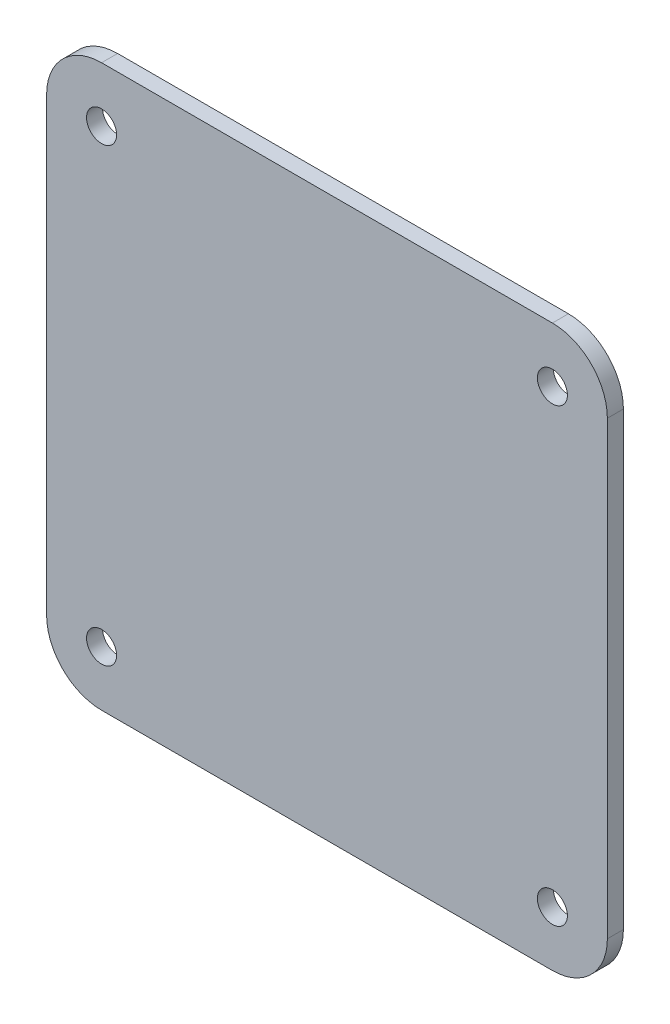
ISO-10303-21;
HEADER;
FILE_DESCRIPTION(('STEP AP214'),'2;1');
FILE_NAME('part.step','',(''),(''),'','','');
FILE_SCHEMA(('AUTOMOTIVE_DESIGN { 1 0 10303 214 1 1 1 1 }'));
ENDSEC;
DATA;
#1=APPLICATION_CONTEXT('core data for automotive mechanical design processes');
#2=APPLICATION_PROTOCOL_DEFINITION('international standard','automotive_design',2000,#1);
#3=PRODUCT_CONTEXT('',#1,'mechanical');
#4=PRODUCT('Part','Part','',(#3));
#5=PRODUCT_RELATED_PRODUCT_CATEGORY('part','',(#4));
#6=PRODUCT_DEFINITION_FORMATION('','',#4);
#7=PRODUCT_DEFINITION_CONTEXT('part definition',#1,'design');
#8=PRODUCT_DEFINITION('design','',#6,#7);
#9=PRODUCT_DEFINITION_SHAPE('','',#8);
#10=(LENGTH_UNIT() NAMED_UNIT(*) SI_UNIT(.MILLI.,.METRE.));
#11=(NAMED_UNIT(*) PLANE_ANGLE_UNIT() SI_UNIT($,.RADIAN.));
#12=(NAMED_UNIT(*) SI_UNIT($,.STERADIAN.) SOLID_ANGLE_UNIT());
#13=UNCERTAINTY_MEASURE_WITH_UNIT(LENGTH_MEASURE(1.E-05),#10,'distance_accuracy_value','');
#14=(GEOMETRIC_REPRESENTATION_CONTEXT(3) GLOBAL_UNCERTAINTY_ASSIGNED_CONTEXT((#13)) GLOBAL_UNIT_ASSIGNED_CONTEXT((#10,
#11,#12)) REPRESENTATION_CONTEXT('',''));
#15=CARTESIAN_POINT('',(0.,0.,0.));
#16=DIRECTION('',(0.,0.,1.));
#17=DIRECTION('',(1.,0.,0.));
#18=AXIS2_PLACEMENT_3D('',#15,#16,#17);
#19=CARTESIAN_POINT('',(-50.5,-5.5,0.));
#20=DIRECTION('',(0.,0.,1.));
#21=DIRECTION('',(1.,0.,0.));
#22=AXIS2_PLACEMENT_3D('',#19,#20,#21);
#23=CYLINDRICAL_SURFACE('',#22,1.5);
#24=DIRECTION('',(0.,0.,1.));
#25=VECTOR('',#24,1.);
#26=CARTESIAN_POINT('',(-49.,-5.5,0.));
#27=LINE('',#26,#25);
#28=CARTESIAN_POINT('',(-49.,-5.5,0.));
#29=VERTEX_POINT('',#28);
#30=CARTESIAN_POINT('',(-49.,-5.5,1.600050800102));
#31=VERTEX_POINT('',#30);
#32=EDGE_CURVE('E11',#29,#31,#27,.T.);
#33=ORIENTED_EDGE('',*,*,#32,.F.);
#34=CARTESIAN_POINT('',(-50.5,-5.5,0.));
#35=DIRECTION('',(0.,0.,1.));
#36=DIRECTION('',(1.,0.,0.));
#37=AXIS2_PLACEMENT_3D('',#34,#35,#36);
#38=CIRCLE('',#37,1.5);
#39=EDGE_CURVE('E142',#29,#29,#38,.T.);
#40=ORIENTED_EDGE('',*,*,#39,.F.);
#41=ORIENTED_EDGE('',*,*,#32,.T.);
#42=CARTESIAN_POINT('',(-50.5,-5.5,1.600050800102));
#43=DIRECTION('',(0.,0.,1.));
#44=DIRECTION('',(1.,0.,0.));
#45=AXIS2_PLACEMENT_3D('',#42,#43,#44);
#46=CIRCLE('',#45,1.5);
#47=EDGE_CURVE('E217',#31,#31,#46,.T.);
#48=ORIENTED_EDGE('',*,*,#47,.T.);
#49=EDGE_LOOP('',(#33,#40,#41,#48));
#50=FACE_BOUND('',#49,.T.);
#51=ADVANCED_FACE('F16',(#50),#23,.F.);
#52=CARTESIAN_POINT('',(-5.5,-5.5,0.));
#53=DIRECTION('',(0.,0.,1.));
#54=DIRECTION('',(1.,0.,0.));
#55=AXIS2_PLACEMENT_3D('',#52,#53,#54);
#56=CYLINDRICAL_SURFACE('',#55,1.5);
#57=DIRECTION('',(0.,0.,1.));
#58=VECTOR('',#57,1.);
#59=CARTESIAN_POINT('',(-4.,-5.5,0.));
#60=LINE('',#59,#58);
#61=CARTESIAN_POINT('',(-4.,-5.5,0.));
#62=VERTEX_POINT('',#61);
#63=CARTESIAN_POINT('',(-4.,-5.5,1.600050800102));
#64=VERTEX_POINT('',#63);
#65=EDGE_CURVE('E27',#62,#64,#60,.T.);
#66=ORIENTED_EDGE('',*,*,#65,.F.);
#67=CARTESIAN_POINT('',(-5.5,-5.5,0.));
#68=DIRECTION('',(0.,0.,1.));
#69=DIRECTION('',(1.,0.,0.));
#70=AXIS2_PLACEMENT_3D('',#67,#68,#69);
#71=CIRCLE('',#70,1.5);
#72=EDGE_CURVE('E169',#62,#62,#71,.T.);
#73=ORIENTED_EDGE('',*,*,#72,.F.);
#74=ORIENTED_EDGE('',*,*,#65,.T.);
#75=CARTESIAN_POINT('',(-5.5,-5.5,1.600050800102));
#76=DIRECTION('',(0.,0.,1.));
#77=DIRECTION('',(1.,0.,0.));
#78=AXIS2_PLACEMENT_3D('',#75,#76,#77);
#79=CIRCLE('',#78,1.5);
#80=EDGE_CURVE('E221',#64,#64,#79,.T.);
#81=ORIENTED_EDGE('',*,*,#80,.T.);
#82=EDGE_LOOP('',(#66,#73,#74,#81));
#83=FACE_BOUND('',#82,.T.);
#84=ADVANCED_FACE('F318',(#83),#56,.F.);
#85=CARTESIAN_POINT('',(-50.5,-50.5,0.));
#86=DIRECTION('',(0.,0.,1.));
#87=DIRECTION('',(1.,0.,0.));
#88=AXIS2_PLACEMENT_3D('',#85,#86,#87);
#89=CYLINDRICAL_SURFACE('',#88,1.5);
#90=DIRECTION('',(0.,0.,1.));
#91=VECTOR('',#90,1.);
#92=CARTESIAN_POINT('',(-49.,-50.5,0.));
#93=LINE('',#92,#91);
#94=CARTESIAN_POINT('',(-49.,-50.5,0.));
#95=VERTEX_POINT('',#94);
#96=CARTESIAN_POINT('',(-49.,-50.5,1.600050800102));
#97=VERTEX_POINT('',#96);
#98=EDGE_CURVE('E174',#95,#97,#93,.T.);
#99=ORIENTED_EDGE('',*,*,#98,.F.);
#100=CARTESIAN_POINT('',(-50.5,-50.5,0.));
#101=DIRECTION('',(0.,0.,1.));
#102=DIRECTION('',(1.,0.,0.));
#103=AXIS2_PLACEMENT_3D('',#100,#101,#102);
#104=CIRCLE('',#103,1.5);
#105=EDGE_CURVE('E173',#95,#95,#104,.T.);
#106=ORIENTED_EDGE('',*,*,#105,.F.);
#107=ORIENTED_EDGE('',*,*,#98,.T.);
#108=CARTESIAN_POINT('',(-50.5,-50.5,1.600050800102));
#109=DIRECTION('',(0.,0.,1.));
#110=DIRECTION('',(1.,0.,0.));
#111=AXIS2_PLACEMENT_3D('',#108,#109,#110);
#112=CIRCLE('',#111,1.5);
#113=EDGE_CURVE('E164',#97,#97,#112,.T.);
#114=ORIENTED_EDGE('',*,*,#113,.T.);
#115=EDGE_LOOP('',(#99,#106,#107,#114));
#116=FACE_BOUND('',#115,.T.);
#117=ADVANCED_FACE('F18',(#116),#89,.F.);
#118=CARTESIAN_POINT('',(-5.5,-50.5,0.));
#119=DIRECTION('',(0.,0.,1.));
#120=DIRECTION('',(1.,0.,0.));
#121=AXIS2_PLACEMENT_3D('',#118,#119,#120);
#122=CYLINDRICAL_SURFACE('',#121,1.5);
#123=DIRECTION('',(0.,0.,1.));
#124=VECTOR('',#123,1.);
#125=CARTESIAN_POINT('',(-4.,-50.5,0.));
#126=LINE('',#125,#124);
#127=CARTESIAN_POINT('',(-4.,-50.5,0.));
#128=VERTEX_POINT('',#127);
#129=CARTESIAN_POINT('',(-4.,-50.5,1.600050800102));
#130=VERTEX_POINT('',#129);
#131=EDGE_CURVE('E177',#128,#130,#126,.T.);
#132=ORIENTED_EDGE('',*,*,#131,.F.);
#133=CARTESIAN_POINT('',(-5.5,-50.5,0.));
#134=DIRECTION('',(0.,0.,1.));
#135=DIRECTION('',(1.,0.,0.));
#136=AXIS2_PLACEMENT_3D('',#133,#134,#135);
#137=CIRCLE('',#136,1.5);
#138=EDGE_CURVE('E199',#128,#128,#137,.T.);
#139=ORIENTED_EDGE('',*,*,#138,.F.);
#140=ORIENTED_EDGE('',*,*,#131,.T.);
#141=CARTESIAN_POINT('',(-5.5,-50.5,1.600050800102));
#142=DIRECTION('',(0.,0.,1.));
#143=DIRECTION('',(1.,0.,0.));
#144=AXIS2_PLACEMENT_3D('',#141,#142,#143);
#145=CIRCLE('',#144,1.5);
#146=EDGE_CURVE('E160',#130,#130,#145,.T.);
#147=ORIENTED_EDGE('',*,*,#146,.T.);
#148=EDGE_LOOP('',(#132,#139,#140,#147));
#149=FACE_BOUND('',#148,.T.);
#150=ADVANCED_FACE('F328',(#149),#122,.F.);
#151=CARTESIAN_POINT('',(-5.5,-5.5,0.));
#152=DIRECTION('',(0.,0.,-1.));
#153=DIRECTION('',(0.,1.,0.));
#154=AXIS2_PLACEMENT_3D('',#151,#152,#153);
#155=CYLINDRICAL_SURFACE('',#154,5.4872999746);
#156=DIRECTION('',(0.,0.,1.));
#157=VECTOR('',#156,1.);
#158=CARTESIAN_POINT('',(-5.5,-0.01270002540005,0.));
#159=LINE('',#158,#157);
#160=CARTESIAN_POINT('',(-5.5,-0.01270002540005,0.));
#161=VERTEX_POINT('',#160);
#162=CARTESIAN_POINT('',(-5.5,-0.01270002540005,1.600050800102));
#163=VERTEX_POINT('',#162);
#164=EDGE_CURVE('E67',#161,#163,#159,.T.);
#165=ORIENTED_EDGE('',*,*,#164,.T.);
#166=CARTESIAN_POINT('',(-5.5,-5.5,1.600050800102));
#167=DIRECTION('',(0.,0.,-1.));
#168=DIRECTION('',(0.,1.,0.));
#169=AXIS2_PLACEMENT_3D('',#166,#167,#168);
#170=CIRCLE('',#169,5.4872999746);
#171=CARTESIAN_POINT('',(-0.01270002540005,-5.5,1.600050800102));
#172=VERTEX_POINT('',#171);
#173=EDGE_CURVE('E126',#163,#172,#170,.T.);
#174=ORIENTED_EDGE('',*,*,#173,.T.);
#175=DIRECTION('',(0.,0.,1.));
#176=VECTOR('',#175,1.);
#177=CARTESIAN_POINT('',(-0.01270002540005,-5.5,0.));
#178=LINE('',#177,#176);
#179=CARTESIAN_POINT('',(-0.01270002540005,-5.5,0.));
#180=VERTEX_POINT('',#179);
#181=EDGE_CURVE('E53',#180,#172,#178,.T.);
#182=ORIENTED_EDGE('',*,*,#181,.F.);
#183=CARTESIAN_POINT('',(-5.5,-5.5,0.));
#184=DIRECTION('',(0.,0.,-1.));
#185=DIRECTION('',(0.,1.,0.));
#186=AXIS2_PLACEMENT_3D('',#183,#184,#185);
#187=CIRCLE('',#186,5.4872999746);
#188=EDGE_CURVE('E20',#161,#180,#187,.T.);
#189=ORIENTED_EDGE('',*,*,#188,.F.);
#190=EDGE_LOOP('',(#165,#174,#182,#189));
#191=FACE_BOUND('',#190,.T.);
#192=ADVANCED_FACE('F127',(#191),#155,.T.);
#193=CARTESIAN_POINT('',(-50.5,-0.01270002540005,0.));
#194=DIRECTION('',(0.,1.,0.));
#195=DIRECTION('',(1.,0.,0.));
#196=AXIS2_PLACEMENT_3D('',#193,#194,#195);
#197=PLANE('',#196);
#198=DIRECTION('',(0.,0.,1.));
#199=VECTOR('',#198,1.);
#200=CARTESIAN_POINT('',(-50.5,-0.01270002540005,0.));
#201=LINE('',#200,#199);
#202=CARTESIAN_POINT('',(-50.5,-0.01270002540005,0.));
#203=VERTEX_POINT('',#202);
#204=CARTESIAN_POINT('',(-50.5,-0.01270002540005,1.600050800102));
#205=VERTEX_POINT('',#204);
#206=EDGE_CURVE('E79',#203,#205,#201,.T.);
#207=ORIENTED_EDGE('',*,*,#206,.T.);
#208=DIRECTION('',(1.,0.,0.));
#209=VECTOR('',#208,1.);
#210=CARTESIAN_POINT('',(-50.5,-0.01270002540005,1.600050800102));
#211=LINE('',#210,#209);
#212=EDGE_CURVE('E131',#205,#163,#211,.T.);
#213=ORIENTED_EDGE('',*,*,#212,.T.);
#214=ORIENTED_EDGE('',*,*,#164,.F.);
#215=DIRECTION('',(1.,0.,0.));
#216=VECTOR('',#215,1.);
#217=CARTESIAN_POINT('',(-50.5,-0.01270002540005,0.));
#218=LINE('',#217,#216);
#219=EDGE_CURVE('E224',#203,#161,#218,.T.);
#220=ORIENTED_EDGE('',*,*,#219,.F.);
#221=EDGE_LOOP('',(#207,#213,#214,#220));
#222=FACE_BOUND('',#221,.T.);
#223=ADVANCED_FACE('F315',(#222),#197,.T.);
#224=CARTESIAN_POINT('',(-0.01270002540005,-5.5,0.));
#225=DIRECTION('',(1.,0.,0.));
#226=DIRECTION('',(0.,-1.,0.));
#227=AXIS2_PLACEMENT_3D('',#224,#225,#226);
#228=PLANE('',#227);
#229=ORIENTED_EDGE('',*,*,#181,.T.);
#230=DIRECTION('',(0.,-1.,0.));
#231=VECTOR('',#230,1.);
#232=CARTESIAN_POINT('',(-0.01270002540005,-5.5,1.600050800102));
#233=LINE('',#232,#231);
#234=CARTESIAN_POINT('',(-0.01270002540005,-50.5,1.600050800102));
#235=VERTEX_POINT('',#234);
#236=EDGE_CURVE('E118',#172,#235,#233,.T.);
#237=ORIENTED_EDGE('',*,*,#236,.T.);
#238=DIRECTION('',(0.,0.,1.));
#239=VECTOR('',#238,1.);
#240=CARTESIAN_POINT('',(-0.01270002540005,-50.5,0.));
#241=LINE('',#240,#239);
#242=CARTESIAN_POINT('',(-0.01270002540005,-50.5,0.));
#243=VERTEX_POINT('',#242);
#244=EDGE_CURVE('E168',#243,#235,#241,.T.);
#245=ORIENTED_EDGE('',*,*,#244,.F.);
#246=DIRECTION('',(0.,-1.,0.));
#247=VECTOR('',#246,1.);
#248=CARTESIAN_POINT('',(-0.01270002540005,-5.5,0.));
#249=LINE('',#248,#247);
#250=EDGE_CURVE('E121',#180,#243,#249,.T.);
#251=ORIENTED_EDGE('',*,*,#250,.F.);
#252=EDGE_LOOP('',(#229,#237,#245,#251));
#253=FACE_BOUND('',#252,.T.);
#254=ADVANCED_FACE('F116',(#253),#228,.T.);
#255=CARTESIAN_POINT('',(-50.5,-5.5,0.));
#256=DIRECTION('',(0.,0.,-1.));
#257=DIRECTION('',(-1.,0.,0.));
#258=AXIS2_PLACEMENT_3D('',#255,#256,#257);
#259=CYLINDRICAL_SURFACE('',#258,5.4872999746);
#260=DIRECTION('',(0.,0.,1.));
#261=VECTOR('',#260,1.);
#262=CARTESIAN_POINT('',(-55.9872999746,-5.5,0.));
#263=LINE('',#262,#261);
#264=CARTESIAN_POINT('',(-55.9872999746,-5.5,0.));
#265=VERTEX_POINT('',#264);
#266=CARTESIAN_POINT('',(-55.9872999746,-5.5,1.600050800102));
#267=VERTEX_POINT('',#266);
#268=EDGE_CURVE('E159',#265,#267,#263,.T.);
#269=ORIENTED_EDGE('',*,*,#268,.T.);
#270=CARTESIAN_POINT('',(-50.5,-5.5,1.600050800102));
#271=DIRECTION('',(0.,0.,-1.));
#272=DIRECTION('',(-1.,0.,0.));
#273=AXIS2_PLACEMENT_3D('',#270,#271,#272);
#274=CIRCLE('',#273,5.4872999746);
#275=EDGE_CURVE('E165',#267,#205,#274,.T.);
#276=ORIENTED_EDGE('',*,*,#275,.T.);
#277=ORIENTED_EDGE('',*,*,#206,.F.);
#278=CARTESIAN_POINT('',(-50.5,-5.5,0.));
#279=DIRECTION('',(0.,0.,-1.));
#280=DIRECTION('',(-1.,0.,0.));
#281=AXIS2_PLACEMENT_3D('',#278,#279,#280);
#282=CIRCLE('',#281,5.4872999746);
#283=EDGE_CURVE('E158',#265,#203,#282,.T.);
#284=ORIENTED_EDGE('',*,*,#283,.F.);
#285=EDGE_LOOP('',(#269,#276,#277,#284));
#286=FACE_BOUND('',#285,.T.);
#287=ADVANCED_FACE('F306',(#286),#259,.T.);
#288=CARTESIAN_POINT('',(-5.5,-50.5,0.));
#289=DIRECTION('',(0.,0.,-1.));
#290=DIRECTION('',(1.,0.,0.));
#291=AXIS2_PLACEMENT_3D('',#288,#289,#290);
#292=CYLINDRICAL_SURFACE('',#291,5.4872999746);
#293=ORIENTED_EDGE('',*,*,#244,.T.);
#294=CARTESIAN_POINT('',(-5.5,-50.5,1.600050800102));
#295=DIRECTION('',(0.,0.,-1.));
#296=DIRECTION('',(1.,0.,0.));
#297=AXIS2_PLACEMENT_3D('',#294,#295,#296);
#298=CIRCLE('',#297,5.4872999746);
#299=CARTESIAN_POINT('',(-5.5,-55.9872999746,1.600050800102));
#300=VERTEX_POINT('',#299);
#301=EDGE_CURVE('E136',#235,#300,#298,.T.);
#302=ORIENTED_EDGE('',*,*,#301,.T.);
#303=DIRECTION('',(0.,0.,1.));
#304=VECTOR('',#303,1.);
#305=CARTESIAN_POINT('',(-5.5,-55.9872999746,0.));
#306=LINE('',#305,#304);
#307=CARTESIAN_POINT('',(-5.5,-55.9872999746,0.));
#308=VERTEX_POINT('',#307);
#309=EDGE_CURVE('E152',#308,#300,#306,.T.);
#310=ORIENTED_EDGE('',*,*,#309,.F.);
#311=CARTESIAN_POINT('',(-5.5,-50.5,0.));
#312=DIRECTION('',(0.,0.,-1.));
#313=DIRECTION('',(1.,0.,0.));
#314=AXIS2_PLACEMENT_3D('',#311,#312,#313);
#315=CIRCLE('',#314,5.4872999746);
#316=EDGE_CURVE('E203',#243,#308,#315,.T.);
#317=ORIENTED_EDGE('',*,*,#316,.F.);
#318=EDGE_LOOP('',(#293,#302,#310,#317));
#319=FACE_BOUND('',#318,.T.);
#320=ADVANCED_FACE('F267',(#319),#292,.T.);
#321=CARTESIAN_POINT('',(-28.,-28.,1.600050800102));
#322=DIRECTION('',(0.,0.,-1.));
#323=DIRECTION('',(0.,-1.,0.));
#324=AXIS2_PLACEMENT_3D('',#321,#322,#323);
#325=PLANE('',#324);
#326=ORIENTED_EDGE('',*,*,#47,.F.);
#327=EDGE_LOOP('',(#326));
#328=FACE_BOUND('',#327,.T.);
#329=ORIENTED_EDGE('',*,*,#80,.F.);
#330=EDGE_LOOP('',(#329));
#331=FACE_BOUND('',#330,.T.);
#332=ORIENTED_EDGE('',*,*,#113,.F.);
#333=EDGE_LOOP('',(#332));
#334=FACE_BOUND('',#333,.T.);
#335=ORIENTED_EDGE('',*,*,#146,.F.);
#336=EDGE_LOOP('',(#335));
#337=FACE_BOUND('',#336,.T.);
#338=DIRECTION('',(-1.,0.,0.));
#339=VECTOR('',#338,1.);
#340=CARTESIAN_POINT('',(-5.5,-55.9872999746,1.600050800102));
#341=LINE('',#340,#339);
#342=CARTESIAN_POINT('',(-50.5,-55.9872999746,1.600050800102));
#343=VERTEX_POINT('',#342);
#344=EDGE_CURVE('E148',#300,#343,#341,.T.);
#345=ORIENTED_EDGE('',*,*,#344,.F.);
#346=ORIENTED_EDGE('',*,*,#301,.F.);
#347=ORIENTED_EDGE('',*,*,#236,.F.);
#348=ORIENTED_EDGE('',*,*,#173,.F.);
#349=ORIENTED_EDGE('',*,*,#212,.F.);
#350=ORIENTED_EDGE('',*,*,#275,.F.);
#351=DIRECTION('',(0.,1.,0.));
#352=VECTOR('',#351,1.);
#353=CARTESIAN_POINT('',(-55.9872999746,-50.5,1.600050800102));
#354=LINE('',#353,#352);
#355=CARTESIAN_POINT('',(-55.9872999746,-50.5,1.600050800102));
#356=VERTEX_POINT('',#355);
#357=EDGE_CURVE('E145',#356,#267,#354,.T.);
#358=ORIENTED_EDGE('',*,*,#357,.F.);
#359=CARTESIAN_POINT('',(-50.5,-50.5,1.600050800102));
#360=DIRECTION('',(0.,0.,-1.));
#361=DIRECTION('',(0.,-1.,0.));
#362=AXIS2_PLACEMENT_3D('',#359,#360,#361);
#363=CIRCLE('',#362,5.4872999746);
#364=EDGE_CURVE('E181',#343,#356,#363,.T.);
#365=ORIENTED_EDGE('',*,*,#364,.F.);
#366=EDGE_LOOP('',(#345,#346,#347,#348,#349,#350,#358,#365));
#367=FACE_BOUND('',#366,.T.);
#368=ADVANCED_FACE('F134',(#328,#331,#334,#337,#367),#325,.F.);
#369=CARTESIAN_POINT('',(-28.,-28.,0.));
#370=DIRECTION('',(0.,0.,-1.));
#371=DIRECTION('',(0.,-1.,0.));
#372=AXIS2_PLACEMENT_3D('',#369,#370,#371);
#373=PLANE('',#372);
#374=ORIENTED_EDGE('',*,*,#39,.T.);
#375=EDGE_LOOP('',(#374));
#376=FACE_BOUND('',#375,.T.);
#377=ORIENTED_EDGE('',*,*,#72,.T.);
#378=EDGE_LOOP('',(#377));
#379=FACE_BOUND('',#378,.T.);
#380=ORIENTED_EDGE('',*,*,#105,.T.);
#381=EDGE_LOOP('',(#380));
#382=FACE_BOUND('',#381,.T.);
#383=ORIENTED_EDGE('',*,*,#138,.T.);
#384=EDGE_LOOP('',(#383));
#385=FACE_BOUND('',#384,.T.);
#386=CARTESIAN_POINT('',(-50.5,-50.5,0.));
#387=DIRECTION('',(0.,0.,-1.));
#388=DIRECTION('',(0.,-1.,0.));
#389=AXIS2_PLACEMENT_3D('',#386,#387,#388);
#390=CIRCLE('',#389,5.4872999746);
#391=CARTESIAN_POINT('',(-50.5,-55.9872999746,0.));
#392=VERTEX_POINT('',#391);
#393=CARTESIAN_POINT('',(-55.9872999746,-50.5,0.));
#394=VERTEX_POINT('',#393);
#395=EDGE_CURVE('E193',#392,#394,#390,.T.);
#396=ORIENTED_EDGE('',*,*,#395,.T.);
#397=DIRECTION('',(0.,1.,0.));
#398=VECTOR('',#397,1.);
#399=CARTESIAN_POINT('',(-55.9872999746,-50.5,0.));
#400=LINE('',#399,#398);
#401=EDGE_CURVE('E154',#394,#265,#400,.T.);
#402=ORIENTED_EDGE('',*,*,#401,.T.);
#403=ORIENTED_EDGE('',*,*,#283,.T.);
#404=ORIENTED_EDGE('',*,*,#219,.T.);
#405=ORIENTED_EDGE('',*,*,#188,.T.);
#406=ORIENTED_EDGE('',*,*,#250,.T.);
#407=ORIENTED_EDGE('',*,*,#316,.T.);
#408=DIRECTION('',(-1.,0.,0.));
#409=VECTOR('',#408,1.);
#410=CARTESIAN_POINT('',(-5.5,-55.9872999746,0.));
#411=LINE('',#410,#409);
#412=EDGE_CURVE('E151',#308,#392,#411,.T.);
#413=ORIENTED_EDGE('',*,*,#412,.T.);
#414=EDGE_LOOP('',(#396,#402,#403,#404,#405,#406,#407,#413));
#415=FACE_BOUND('',#414,.T.);
#416=ADVANCED_FACE('F296',(#376,#379,#382,#385,#415),#373,.T.);
#417=CARTESIAN_POINT('',(-55.9872999746,-50.5,0.));
#418=DIRECTION('',(-1.,0.,0.));
#419=DIRECTION('',(0.,0.,1.));
#420=AXIS2_PLACEMENT_3D('',#417,#418,#419);
#421=PLANE('',#420);
#422=DIRECTION('',(0.,0.,1.));
#423=VECTOR('',#422,1.);
#424=CARTESIAN_POINT('',(-55.9872999746,-50.5,0.));
#425=LINE('',#424,#423);
#426=EDGE_CURVE('E184',#394,#356,#425,.T.);
#427=ORIENTED_EDGE('',*,*,#426,.T.);
#428=ORIENTED_EDGE('',*,*,#357,.T.);
#429=ORIENTED_EDGE('',*,*,#268,.F.);
#430=ORIENTED_EDGE('',*,*,#401,.F.);
#431=EDGE_LOOP('',(#427,#428,#429,#430));
#432=FACE_BOUND('',#431,.T.);
#433=ADVANCED_FACE('F299',(#432),#421,.T.);
#434=CARTESIAN_POINT('',(-5.5,-55.9872999746,0.));
#435=DIRECTION('',(0.,-1.,0.));
#436=DIRECTION('',(-1.,0.,0.));
#437=AXIS2_PLACEMENT_3D('',#434,#435,#436);
#438=PLANE('',#437);
#439=ORIENTED_EDGE('',*,*,#309,.T.);
#440=ORIENTED_EDGE('',*,*,#344,.T.);
#441=DIRECTION('',(0.,0.,1.));
#442=VECTOR('',#441,1.);
#443=CARTESIAN_POINT('',(-50.5,-55.9872999746,0.));
#444=LINE('',#443,#442);
#445=EDGE_CURVE('E185',#392,#343,#444,.T.);
#446=ORIENTED_EDGE('',*,*,#445,.F.);
#447=ORIENTED_EDGE('',*,*,#412,.F.);
#448=EDGE_LOOP('',(#439,#440,#446,#447));
#449=FACE_BOUND('',#448,.T.);
#450=ADVANCED_FACE('F261',(#449),#438,.T.);
#451=CARTESIAN_POINT('',(-50.5,-50.5,0.));
#452=DIRECTION('',(0.,0.,-1.));
#453=DIRECTION('',(0.,-1.,0.));
#454=AXIS2_PLACEMENT_3D('',#451,#452,#453);
#455=CYLINDRICAL_SURFACE('',#454,5.4872999746);
#456=ORIENTED_EDGE('',*,*,#445,.T.);
#457=ORIENTED_EDGE('',*,*,#364,.T.);
#458=ORIENTED_EDGE('',*,*,#426,.F.);
#459=ORIENTED_EDGE('',*,*,#395,.F.);
#460=EDGE_LOOP('',(#456,#457,#458,#459));
#461=FACE_BOUND('',#460,.T.);
#462=ADVANCED_FACE('F304',(#461),#455,.T.);
#463=CLOSED_SHELL('',(#51,#84,#117,#150,#192,#223,#254,#287,#320,#368,#416,#433,#450,#462));
#464=MANIFOLD_SOLID_BREP('B1',#463);
#465=ADVANCED_BREP_SHAPE_REPRESENTATION('',(#18,#464),#14);
#466=SHAPE_DEFINITION_REPRESENTATION(#9,#465);
ENDSEC;
END-ISO-10303-21;
